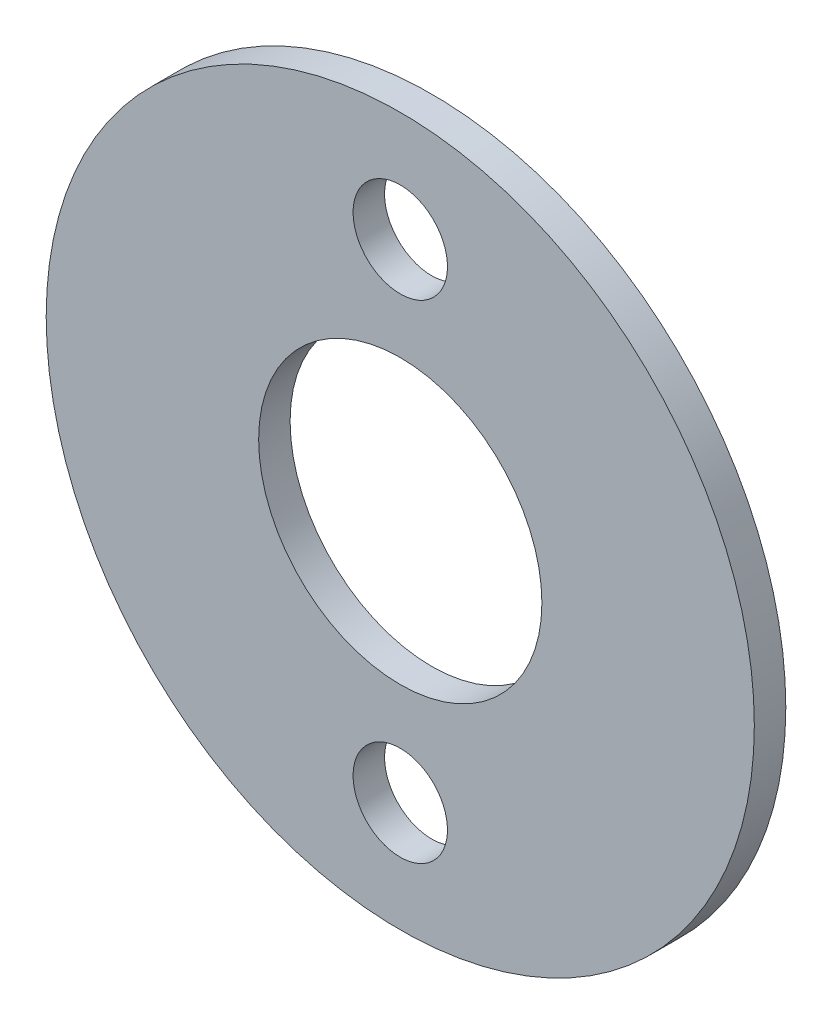
ISO-10303-21;
HEADER;
FILE_DESCRIPTION(('STEP AP214'),'2;1');
FILE_NAME('part.step','',(''),(''),'','','');
FILE_SCHEMA(('AUTOMOTIVE_DESIGN { 1 0 10303 214 1 1 1 1 }'));
ENDSEC;
DATA;
#1=APPLICATION_CONTEXT('core data for automotive mechanical design processes');
#2=APPLICATION_PROTOCOL_DEFINITION('international standard','automotive_design',2000,#1);
#3=PRODUCT_CONTEXT('',#1,'mechanical');
#4=PRODUCT('Part','Part','',(#3));
#5=PRODUCT_RELATED_PRODUCT_CATEGORY('part','',(#4));
#6=PRODUCT_DEFINITION_FORMATION('','',#4);
#7=PRODUCT_DEFINITION_CONTEXT('part definition',#1,'design');
#8=PRODUCT_DEFINITION('design','',#6,#7);
#9=PRODUCT_DEFINITION_SHAPE('','',#8);
#10=(LENGTH_UNIT() NAMED_UNIT(*) SI_UNIT(.MILLI.,.METRE.));
#11=(NAMED_UNIT(*) PLANE_ANGLE_UNIT() SI_UNIT($,.RADIAN.));
#12=(NAMED_UNIT(*) SI_UNIT($,.STERADIAN.) SOLID_ANGLE_UNIT());
#13=UNCERTAINTY_MEASURE_WITH_UNIT(LENGTH_MEASURE(1.E-05),#10,'distance_accuracy_value','');
#14=(GEOMETRIC_REPRESENTATION_CONTEXT(3) GLOBAL_UNCERTAINTY_ASSIGNED_CONTEXT((#13)) GLOBAL_UNIT_ASSIGNED_CONTEXT((#10,
#11,#12)) REPRESENTATION_CONTEXT('',''));
#15=CARTESIAN_POINT('',(0.,0.,0.));
#16=DIRECTION('',(0.,0.,1.));
#17=DIRECTION('',(1.,0.,0.));
#18=AXIS2_PLACEMENT_3D('',#15,#16,#17);
#19=CARTESIAN_POINT('',(0.,15.5,0.));
#20=DIRECTION('',(0.,0.,-1.));
#21=DIRECTION('',(-1.,0.,0.));
#22=AXIS2_PLACEMENT_3D('',#19,#20,#21);
#23=CYLINDRICAL_SURFACE('',#22,3.);
#24=CARTESIAN_POINT('',(0.,15.50000000001,0.));
#25=DIRECTION('',(0.,0.,1.));
#26=DIRECTION('',(-1.,0.,0.));
#27=AXIS2_PLACEMENT_3D('',#24,#25,#26);
#28=CIRCLE('',#27,3.00000000001);
#29=CARTESIAN_POINT('',(-3.00000000001,15.50000000001,0.));
#30=VERTEX_POINT('',#29);
#31=EDGE_CURVE('E34',#30,#30,#28,.T.);
#32=ORIENTED_EDGE('',*,*,#31,.F.);
#33=EDGE_LOOP('',(#32));
#34=FACE_BOUND('',#33,.T.);
#35=CARTESIAN_POINT('',(0.,15.50000000001,2.00000000001));
#36=DIRECTION('',(0.,0.,-1.));
#37=DIRECTION('',(-1.,0.,0.));
#38=AXIS2_PLACEMENT_3D('',#35,#36,#37);
#39=CIRCLE('',#38,3.00000000001);
#40=CARTESIAN_POINT('',(-3.00000000001,15.50000000001,2.00000000001));
#41=VERTEX_POINT('',#40);
#42=EDGE_CURVE('E19',#41,#41,#39,.T.);
#43=ORIENTED_EDGE('',*,*,#42,.F.);
#44=EDGE_LOOP('',(#43));
#45=FACE_BOUND('',#44,.T.);
#46=ADVANCED_FACE('F15',(#34,#45),#23,.F.);
#47=CARTESIAN_POINT('',(0.,-15.5,0.));
#48=DIRECTION('',(0.,0.,-1.));
#49=DIRECTION('',(-1.,0.,0.));
#50=AXIS2_PLACEMENT_3D('',#47,#48,#49);
#51=CYLINDRICAL_SURFACE('',#50,3.);
#52=CARTESIAN_POINT('',(0.,-15.50000000001,0.));
#53=DIRECTION('',(0.,0.,1.));
#54=DIRECTION('',(-1.,0.,0.));
#55=AXIS2_PLACEMENT_3D('',#52,#53,#54);
#56=CIRCLE('',#55,3.00000000001);
#57=CARTESIAN_POINT('',(-3.00000000001,-15.50000000001,0.));
#58=VERTEX_POINT('',#57);
#59=EDGE_CURVE('E39',#58,#58,#56,.T.);
#60=ORIENTED_EDGE('',*,*,#59,.F.);
#61=EDGE_LOOP('',(#60));
#62=FACE_BOUND('',#61,.T.);
#63=CARTESIAN_POINT('',(0.,-15.50000000001,2.00000000001));
#64=DIRECTION('',(0.,0.,-1.));
#65=DIRECTION('',(-1.,0.,0.));
#66=AXIS2_PLACEMENT_3D('',#63,#64,#65);
#67=CIRCLE('',#66,3.00000000001);
#68=CARTESIAN_POINT('',(-3.00000000001,-15.50000000001,2.00000000001));
#69=VERTEX_POINT('',#68);
#70=EDGE_CURVE('E60',#69,#69,#67,.T.);
#71=ORIENTED_EDGE('',*,*,#70,.F.);
#72=EDGE_LOOP('',(#71));
#73=FACE_BOUND('',#72,.T.);
#74=ADVANCED_FACE('F83',(#62,#73),#51,.F.);
#75=CARTESIAN_POINT('',(0.,0.,0.));
#76=DIRECTION('',(0.,0.,-1.));
#77=DIRECTION('',(-1.,0.,0.));
#78=AXIS2_PLACEMENT_3D('',#75,#76,#77);
#79=CYLINDRICAL_SURFACE('',#78,9.);
#80=CARTESIAN_POINT('',(0.,0.,0.));
#81=DIRECTION('',(0.,0.,1.));
#82=DIRECTION('',(-1.,0.,0.));
#83=AXIS2_PLACEMENT_3D('',#80,#81,#82);
#84=CIRCLE('',#83,9.00000000001);
#85=CARTESIAN_POINT('',(-9.00000000001,0.,0.));
#86=VERTEX_POINT('',#85);
#87=EDGE_CURVE('E37',#86,#86,#84,.T.);
#88=ORIENTED_EDGE('',*,*,#87,.F.);
#89=EDGE_LOOP('',(#88));
#90=FACE_BOUND('',#89,.T.);
#91=CARTESIAN_POINT('',(0.,0.,2.00000000001));
#92=DIRECTION('',(0.,0.,-1.));
#93=DIRECTION('',(-1.,0.,0.));
#94=AXIS2_PLACEMENT_3D('',#91,#92,#93);
#95=CIRCLE('',#94,9.00000000001);
#96=CARTESIAN_POINT('',(-9.00000000001,0.,2.00000000001));
#97=VERTEX_POINT('',#96);
#98=EDGE_CURVE('E67',#97,#97,#95,.T.);
#99=ORIENTED_EDGE('',*,*,#98,.F.);
#100=EDGE_LOOP('',(#99));
#101=FACE_BOUND('',#100,.T.);
#102=ADVANCED_FACE('F17',(#90,#101),#79,.F.);
#103=CARTESIAN_POINT('',(0.,0.,0.));
#104=DIRECTION('',(0.,0.,-1.));
#105=DIRECTION('',(-1.,0.,0.));
#106=AXIS2_PLACEMENT_3D('',#103,#104,#105);
#107=CYLINDRICAL_SURFACE('',#106,22.5);
#108=CARTESIAN_POINT('',(0.,0.,0.));
#109=DIRECTION('',(0.,0.,-1.));
#110=DIRECTION('',(-1.,0.,0.));
#111=AXIS2_PLACEMENT_3D('',#108,#109,#110);
#112=CIRCLE('',#111,22.50000000001);
#113=CARTESIAN_POINT('',(-22.50000000001,0.,0.));
#114=VERTEX_POINT('',#113);
#115=EDGE_CURVE('E24',#114,#114,#112,.T.);
#116=ORIENTED_EDGE('',*,*,#115,.F.);
#117=EDGE_LOOP('',(#116));
#118=FACE_BOUND('',#117,.T.);
#119=CARTESIAN_POINT('',(0.,0.,2.00000000001));
#120=DIRECTION('',(0.,0.,-1.));
#121=DIRECTION('',(-1.,0.,0.));
#122=AXIS2_PLACEMENT_3D('',#119,#120,#121);
#123=CIRCLE('',#122,22.50000000001);
#124=CARTESIAN_POINT('',(-22.50000000001,0.,2.00000000001));
#125=VERTEX_POINT('',#124);
#126=EDGE_CURVE('E10',#125,#125,#123,.T.);
#127=ORIENTED_EDGE('',*,*,#126,.T.);
#128=EDGE_LOOP('',(#127));
#129=FACE_BOUND('',#128,.T.);
#130=ADVANCED_FACE('F82',(#118,#129),#107,.T.);
#131=CARTESIAN_POINT('',(22.5,0.,0.));
#132=DIRECTION('',(0.,0.,-1.));
#133=DIRECTION('',(0.,-1.,0.));
#134=AXIS2_PLACEMENT_3D('',#131,#132,#133);
#135=PLANE('',#134);
#136=ORIENTED_EDGE('',*,*,#115,.T.);
#137=EDGE_LOOP('',(#136));
#138=FACE_BOUND('',#137,.T.);
#139=ORIENTED_EDGE('',*,*,#31,.T.);
#140=EDGE_LOOP('',(#139));
#141=FACE_BOUND('',#140,.T.);
#142=ORIENTED_EDGE('',*,*,#59,.T.);
#143=EDGE_LOOP('',(#142));
#144=FACE_BOUND('',#143,.T.);
#145=ORIENTED_EDGE('',*,*,#87,.T.);
#146=EDGE_LOOP('',(#145));
#147=FACE_BOUND('',#146,.T.);
#148=ADVANCED_FACE('F90',(#138,#141,#144,#147),#135,.T.);
#149=CARTESIAN_POINT('',(22.5,0.,2.));
#150=DIRECTION('',(0.,0.,-1.));
#151=DIRECTION('',(0.,-1.,0.));
#152=AXIS2_PLACEMENT_3D('',#149,#150,#151);
#153=PLANE('',#152);
#154=ORIENTED_EDGE('',*,*,#126,.F.);
#155=EDGE_LOOP('',(#154));
#156=FACE_BOUND('',#155,.T.);
#157=ORIENTED_EDGE('',*,*,#42,.T.);
#158=EDGE_LOOP('',(#157));
#159=FACE_BOUND('',#158,.T.);
#160=ORIENTED_EDGE('',*,*,#70,.T.);
#161=EDGE_LOOP('',(#160));
#162=FACE_BOUND('',#161,.T.);
#163=ORIENTED_EDGE('',*,*,#98,.T.);
#164=EDGE_LOOP('',(#163));
#165=FACE_BOUND('',#164,.T.);
#166=ADVANCED_FACE('F79',(#156,#159,#162,#165),#153,.F.);
#167=CLOSED_SHELL('',(#46,#74,#102,#130,#148,#166));
#168=MANIFOLD_SOLID_BREP('B1',#167);
#169=ADVANCED_BREP_SHAPE_REPRESENTATION('',(#18,#168),#14);
#170=SHAPE_DEFINITION_REPRESENTATION(#9,#169);
ENDSEC;
END-ISO-10303-21;
